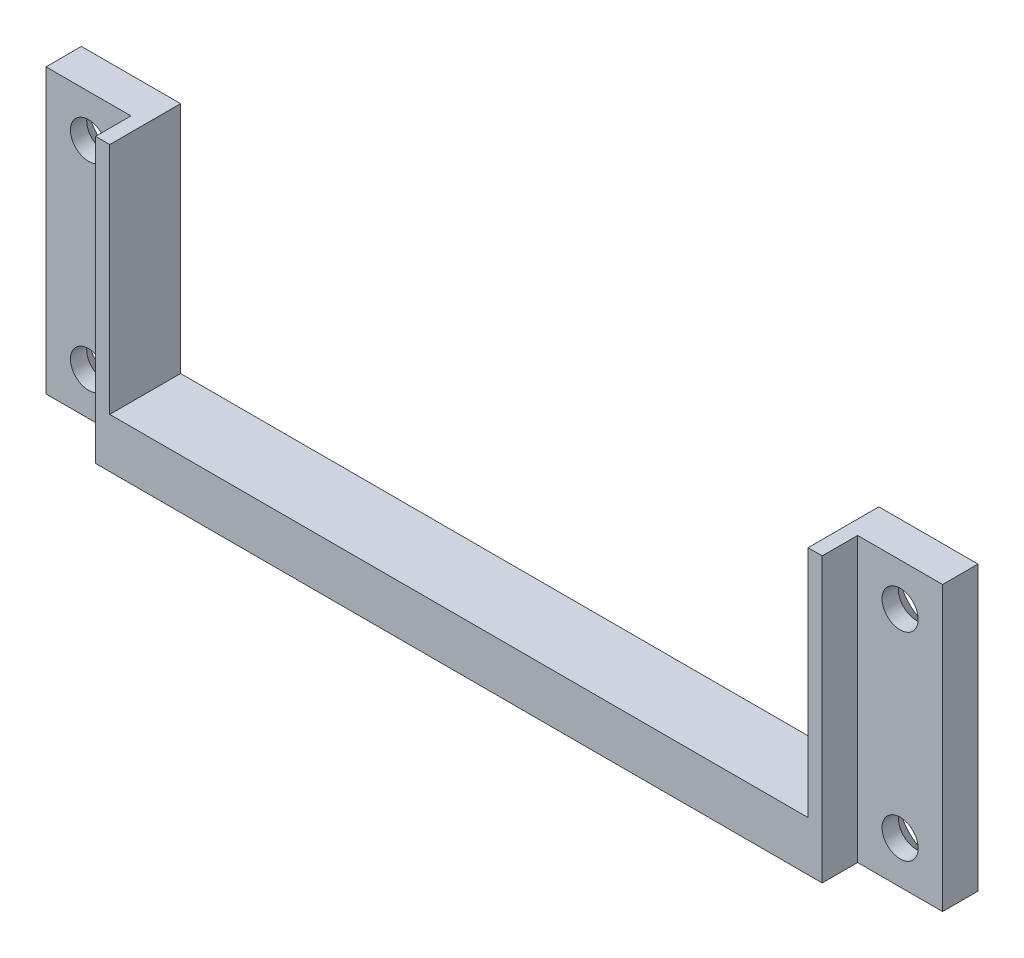
ISO-10303-21;
HEADER;
FILE_DESCRIPTION(('STEP AP214'),'2;1');
FILE_NAME('part.step','',(''),(''),'','','');
FILE_SCHEMA(('AUTOMOTIVE_DESIGN { 1 0 10303 214 1 1 1 1 }'));
ENDSEC;
DATA;
#1=APPLICATION_CONTEXT('core data for automotive mechanical design processes');
#2=APPLICATION_PROTOCOL_DEFINITION('international standard','automotive_design',2000,#1);
#3=PRODUCT_CONTEXT('',#1,'mechanical');
#4=PRODUCT('Part','Part','',(#3));
#5=PRODUCT_RELATED_PRODUCT_CATEGORY('part','',(#4));
#6=PRODUCT_DEFINITION_FORMATION('','',#4);
#7=PRODUCT_DEFINITION_CONTEXT('part definition',#1,'design');
#8=PRODUCT_DEFINITION('design','',#6,#7);
#9=PRODUCT_DEFINITION_SHAPE('','',#8);
#10=(LENGTH_UNIT() NAMED_UNIT(*) SI_UNIT(.MILLI.,.METRE.));
#11=(NAMED_UNIT(*) PLANE_ANGLE_UNIT() SI_UNIT($,.RADIAN.));
#12=(NAMED_UNIT(*) SI_UNIT($,.STERADIAN.) SOLID_ANGLE_UNIT());
#13=UNCERTAINTY_MEASURE_WITH_UNIT(LENGTH_MEASURE(1.E-05),#10,'distance_accuracy_value','');
#14=(GEOMETRIC_REPRESENTATION_CONTEXT(3) GLOBAL_UNCERTAINTY_ASSIGNED_CONTEXT((#13)) GLOBAL_UNIT_ASSIGNED_CONTEXT((#10,
#11,#12)) REPRESENTATION_CONTEXT('',''));
#15=CARTESIAN_POINT('',(0.,0.,0.));
#16=DIRECTION('',(0.,0.,1.));
#17=DIRECTION('',(1.,0.,0.));
#18=AXIS2_PLACEMENT_3D('',#15,#16,#17);
#19=CARTESIAN_POINT('',(-17.4678296060201,19.1867469879518,-0.0001));
#20=DIRECTION('',(0.,1.,0.));
#21=DIRECTION('',(0.,0.,1.));
#22=AXIS2_PLACEMENT_3D('',#19,#20,#21);
#23=PLANE('',#22);
#24=DIRECTION('',(0.,0.,1.));
#25=VECTOR('',#24,1.);
#26=CARTESIAN_POINT('',(-15.4678296060201,19.1867469879518,51.5999));
#27=LINE('',#26,#25);
#28=CARTESIAN_POINT('',(-15.4678296060201,19.1867469879518,-0.0001));
#29=VERTEX_POINT('',#28);
#30=CARTESIAN_POINT('',(-15.4678296060201,19.1867469879518,10.));
#31=VERTEX_POINT('',#30);
#32=EDGE_CURVE('E207',#29,#31,#27,.T.);
#33=ORIENTED_EDGE('',*,*,#32,.F.);
#34=DIRECTION('',(-1.,0.,0.));
#35=VECTOR('',#34,1.);
#36=CARTESIAN_POINT('',(-17.4678296060201,19.1867469879518,-0.0001));
#37=LINE('',#36,#35);
#38=CARTESIAN_POINT('',(-29.4678296060201,19.1867469879518,-0.0001));
#39=VERTEX_POINT('',#38);
#40=EDGE_CURVE('E153',#29,#39,#37,.T.);
#41=ORIENTED_EDGE('',*,*,#40,.T.);
#42=DIRECTION('',(0.,0.,-1.));
#43=VECTOR('',#42,1.);
#44=CARTESIAN_POINT('',(-29.4678296060201,19.1867469879518,-0.0001));
#45=LINE('',#44,#43);
#46=CARTESIAN_POINT('',(-29.4678296060201,19.1867469879518,4.9999));
#47=VERTEX_POINT('',#46);
#48=EDGE_CURVE('E188',#47,#39,#45,.T.);
#49=ORIENTED_EDGE('',*,*,#48,.F.);
#50=DIRECTION('',(1.,0.,0.));
#51=VECTOR('',#50,1.);
#52=CARTESIAN_POINT('',(-29.4678296060201,19.1867469879518,4.9999));
#53=LINE('',#52,#51);
#54=CARTESIAN_POINT('',(-17.4678296060201,19.1867469879518,4.9999));
#55=VERTEX_POINT('',#54);
#56=EDGE_CURVE('E191',#47,#55,#53,.T.);
#57=ORIENTED_EDGE('',*,*,#56,.T.);
#58=DIRECTION('',(0.,0.,1.));
#59=VECTOR('',#58,1.);
#60=CARTESIAN_POINT('',(-17.4678296060201,19.1867469879518,-0.0001));
#61=LINE('',#60,#59);
#62=CARTESIAN_POINT('',(-17.4678296060201,19.1867469879518,10.));
#63=VERTEX_POINT('',#62);
#64=EDGE_CURVE('E230',#55,#63,#61,.T.);
#65=ORIENTED_EDGE('',*,*,#64,.T.);
#66=DIRECTION('',(-1.,0.,0.));
#67=VECTOR('',#66,1.);
#68=CARTESIAN_POINT('',(-17.4678296060201,19.1867469879518,10.));
#69=LINE('',#68,#67);
#70=EDGE_CURVE('E226',#31,#63,#69,.T.);
#71=ORIENTED_EDGE('',*,*,#70,.F.);
#72=EDGE_LOOP('',(#33,#41,#49,#57,#65,#71));
#73=FACE_BOUND('',#72,.T.);
#74=ADVANCED_FACE('F48',(#73),#23,.T.);
#75=CARTESIAN_POINT('',(-17.4678296060201,19.1867469879518,-0.0001));
#76=DIRECTION('',(-1.,0.,0.));
#77=DIRECTION('',(0.,0.,1.));
#78=AXIS2_PLACEMENT_3D('',#75,#76,#77);
#79=PLANE('',#78);
#80=DIRECTION('',(0.,1.,0.));
#81=VECTOR('',#80,1.);
#82=CARTESIAN_POINT('',(-17.4678296060201,19.1867469879518,4.9999));
#83=LINE('',#82,#81);
#84=CARTESIAN_POINT('',(-17.4678296060201,-20.8132530120482,4.9999));
#85=VERTEX_POINT('',#84);
#86=EDGE_CURVE('E73',#85,#55,#83,.T.);
#87=ORIENTED_EDGE('',*,*,#86,.F.);
#88=DIRECTION('',(0.,0.,-1.));
#89=VECTOR('',#88,1.);
#90=CARTESIAN_POINT('',(-17.4678296060201,-20.8132530120482,-0.0001));
#91=LINE('',#90,#89);
#92=CARTESIAN_POINT('',(-17.4678296060201,-20.8132530120482,10.));
#93=VERTEX_POINT('',#92);
#94=EDGE_CURVE('E203',#93,#85,#91,.T.);
#95=ORIENTED_EDGE('',*,*,#94,.F.);
#96=DIRECTION('',(0.,-1.,0.));
#97=VECTOR('',#96,1.);
#98=CARTESIAN_POINT('',(-17.4678296060201,19.1867469879518,10.));
#99=LINE('',#98,#97);
#100=EDGE_CURVE('E220',#63,#93,#99,.T.);
#101=ORIENTED_EDGE('',*,*,#100,.F.);
#102=ORIENTED_EDGE('',*,*,#64,.F.);
#103=EDGE_LOOP('',(#87,#95,#101,#102));
#104=FACE_BOUND('',#103,.T.);
#105=ADVANCED_FACE('F50',(#104),#79,.T.);
#106=DIRECTION('',(0.,0.,-1.));
#107=VECTOR('',#106,1.);
#108=CARTESIAN_POINT('',(83.1321703939799,19.1867469879518,51.5999));
#109=LINE('',#108,#107);
#110=CARTESIAN_POINT('',(83.1321703939799,19.1867469879518,10.));
#111=VERTEX_POINT('',#110);
#112=CARTESIAN_POINT('',(83.1321703939799,19.1867469879518,-0.0001));
#113=VERTEX_POINT('',#112);
#114=EDGE_CURVE('E211',#111,#113,#109,.T.);
#115=ORIENTED_EDGE('',*,*,#114,.F.);
#116=CARTESIAN_POINT('',(85.1321703939799,19.1867469879518,10.));
#117=VERTEX_POINT('',#116);
#118=EDGE_CURVE('E227',#117,#111,#69,.T.);
#119=ORIENTED_EDGE('',*,*,#118,.F.);
#120=DIRECTION('',(0.,0.,1.));
#121=VECTOR('',#120,1.);
#122=CARTESIAN_POINT('',(85.1321703939799,19.1867469879518,-0.0001));
#123=LINE('',#122,#121);
#124=CARTESIAN_POINT('',(85.1321703939799,19.1867469879518,4.9999));
#125=VERTEX_POINT('',#124);
#126=EDGE_CURVE('E152',#125,#117,#123,.T.);
#127=ORIENTED_EDGE('',*,*,#126,.F.);
#128=DIRECTION('',(-1.,0.,0.));
#129=VECTOR('',#128,1.);
#130=CARTESIAN_POINT('',(97.1321703939799,19.1867469879518,4.9999));
#131=LINE('',#130,#129);
#132=CARTESIAN_POINT('',(97.1321703939799,19.1867469879518,4.9999));
#133=VERTEX_POINT('',#132);
#134=EDGE_CURVE('E159',#133,#125,#131,.T.);
#135=ORIENTED_EDGE('',*,*,#134,.F.);
#136=DIRECTION('',(0.,0.,1.));
#137=VECTOR('',#136,1.);
#138=CARTESIAN_POINT('',(97.1321703939799,19.1867469879518,-0.0001));
#139=LINE('',#138,#137);
#140=CARTESIAN_POINT('',(97.1321703939799,19.1867469879518,-0.0001));
#141=VERTEX_POINT('',#140);
#142=EDGE_CURVE('E156',#141,#133,#139,.T.);
#143=ORIENTED_EDGE('',*,*,#142,.F.);
#144=EDGE_CURVE('E141',#141,#113,#37,.T.);
#145=ORIENTED_EDGE('',*,*,#144,.T.);
#146=EDGE_LOOP('',(#115,#119,#127,#135,#143,#145));
#147=FACE_BOUND('',#146,.T.);
#148=ADVANCED_FACE('F157',(#147),#23,.T.);
#149=CARTESIAN_POINT('',(85.1321703939799,19.1867469879518,-0.0001));
#150=DIRECTION('',(1.,0.,0.));
#151=DIRECTION('',(0.,0.,-1.));
#152=AXIS2_PLACEMENT_3D('',#149,#150,#151);
#153=PLANE('',#152);
#154=DIRECTION('',(0.,-1.,0.));
#155=VECTOR('',#154,1.);
#156=CARTESIAN_POINT('',(85.1321703939799,19.1867469879518,4.9999));
#157=LINE('',#156,#155);
#158=CARTESIAN_POINT('',(85.1321703939799,-20.8132530120482,4.99989999999999));
#159=VERTEX_POINT('',#158);
#160=EDGE_CURVE('E65',#125,#159,#157,.T.);
#161=ORIENTED_EDGE('',*,*,#160,.F.);
#162=ORIENTED_EDGE('',*,*,#126,.T.);
#163=DIRECTION('',(0.,1.,0.));
#164=VECTOR('',#163,1.);
#165=CARTESIAN_POINT('',(85.1321703939799,19.1867469879518,10.));
#166=LINE('',#165,#164);
#167=CARTESIAN_POINT('',(85.1321703939799,-20.8132530120482,10.));
#168=VERTEX_POINT('',#167);
#169=EDGE_CURVE('E223',#168,#117,#166,.T.);
#170=ORIENTED_EDGE('',*,*,#169,.F.);
#171=DIRECTION('',(0.,0.,1.));
#172=VECTOR('',#171,1.);
#173=CARTESIAN_POINT('',(85.1321703939799,-20.8132530120482,-0.0001));
#174=LINE('',#173,#172);
#175=EDGE_CURVE('E198',#159,#168,#174,.T.);
#176=ORIENTED_EDGE('',*,*,#175,.F.);
#177=EDGE_LOOP('',(#161,#162,#170,#176));
#178=FACE_BOUND('',#177,.T.);
#179=ADVANCED_FACE('F290',(#178),#153,.T.);
#180=CARTESIAN_POINT('',(0.,0.,-0.0001));
#181=DIRECTION('',(0.,0.,1.));
#182=DIRECTION('',(1.,0.,0.));
#183=AXIS2_PLACEMENT_3D('',#180,#181,#182);
#184=PLANE('',#183);
#185=CARTESIAN_POINT('',(91.1321703939799,13.1867469879518,-0.000100000000001735));
#186=DIRECTION('',(0.,0.,-1.));
#187=DIRECTION('',(-1.,0.,0.));
#188=AXIS2_PLACEMENT_3D('',#185,#186,#187);
#189=CIRCLE('',#188,5.250000041);
#190=CARTESIAN_POINT('',(85.8821703529799,13.1867469879518,-0.000100000000001735));
#191=VERTEX_POINT('',#190);
#192=EDGE_CURVE('E415',#191,#191,#189,.T.);
#193=ORIENTED_EDGE('',*,*,#192,.F.);
#194=EDGE_LOOP('',(#193));
#195=FACE_BOUND('',#194,.T.);
#196=CARTESIAN_POINT('',(91.1321703939799,-14.8132530120482,-0.000100000000001735));
#197=DIRECTION('',(0.,0.,-1.));
#198=DIRECTION('',(-1.,0.,0.));
#199=AXIS2_PLACEMENT_3D('',#196,#197,#198);
#200=CIRCLE('',#199,5.250000041);
#201=CARTESIAN_POINT('',(85.8821703529799,-14.8132530120482,-0.000100000000001735));
#202=VERTEX_POINT('',#201);
#203=EDGE_CURVE('E251',#202,#202,#200,.T.);
#204=ORIENTED_EDGE('',*,*,#203,.F.);
#205=EDGE_LOOP('',(#204));
#206=FACE_BOUND('',#205,.T.);
#207=CARTESIAN_POINT('',(-23.4678296060201,13.1867469879518,-0.000100000000001735));
#208=DIRECTION('',(0.,0.,-1.));
#209=DIRECTION('',(-1.,0.,0.));
#210=AXIS2_PLACEMENT_3D('',#207,#208,#209);
#211=CIRCLE('',#210,5.250000041);
#212=CARTESIAN_POINT('',(-28.7178296470201,13.1867469879518,-0.000100000000001735));
#213=VERTEX_POINT('',#212);
#214=EDGE_CURVE('E244',#213,#213,#211,.T.);
#215=ORIENTED_EDGE('',*,*,#214,.F.);
#216=EDGE_LOOP('',(#215));
#217=FACE_BOUND('',#216,.T.);
#218=CARTESIAN_POINT('',(-23.4678296060201,-14.8132530120482,-0.000100000000001735));
#219=DIRECTION('',(0.,0.,-1.));
#220=DIRECTION('',(-1.,0.,0.));
#221=AXIS2_PLACEMENT_3D('',#218,#219,#220);
#222=CIRCLE('',#221,5.250000041);
#223=CARTESIAN_POINT('',(-28.7178296470201,-14.8132530120482,-0.000100000000001735));
#224=VERTEX_POINT('',#223);
#225=EDGE_CURVE('E240',#224,#224,#222,.T.);
#226=ORIENTED_EDGE('',*,*,#225,.F.);
#227=EDGE_LOOP('',(#226));
#228=FACE_BOUND('',#227,.T.);
#229=ORIENTED_EDGE('',*,*,#40,.F.);
#230=DIRECTION('',(0.,1.,0.));
#231=VECTOR('',#230,1.);
#232=CARTESIAN_POINT('',(-15.4678296060201,-13.8132530120482,-0.0001));
#233=LINE('',#232,#231);
#234=CARTESIAN_POINT('',(-15.4678296060201,-13.8132530120482,-0.0001));
#235=VERTEX_POINT('',#234);
#236=EDGE_CURVE('E218',#235,#29,#233,.T.);
#237=ORIENTED_EDGE('',*,*,#236,.F.);
#238=DIRECTION('',(-1.,0.,0.));
#239=VECTOR('',#238,1.);
#240=CARTESIAN_POINT('',(-15.4678296060201,-13.8132530120482,-0.0001));
#241=LINE('',#240,#239);
#242=CARTESIAN_POINT('',(83.1321703939799,-13.8132530120482,-0.0001));
#243=VERTEX_POINT('',#242);
#244=EDGE_CURVE('E213',#243,#235,#241,.T.);
#245=ORIENTED_EDGE('',*,*,#244,.F.);
#246=DIRECTION('',(0.,1.,0.));
#247=VECTOR('',#246,1.);
#248=CARTESIAN_POINT('',(83.1321703939799,-13.8132530120482,-0.0001));
#249=LINE('',#248,#247);
#250=EDGE_CURVE('E149',#243,#113,#249,.T.);
#251=ORIENTED_EDGE('',*,*,#250,.T.);
#252=ORIENTED_EDGE('',*,*,#144,.F.);
#253=DIRECTION('',(0.,1.,0.));
#254=VECTOR('',#253,1.);
#255=CARTESIAN_POINT('',(97.1321703939799,19.1867469879518,-0.0001));
#256=LINE('',#255,#254);
#257=CARTESIAN_POINT('',(97.1321703939799,-20.8132530120482,-0.0001));
#258=VERTEX_POINT('',#257);
#259=EDGE_CURVE('E146',#258,#141,#256,.T.);
#260=ORIENTED_EDGE('',*,*,#259,.F.);
#261=DIRECTION('',(1.,0.,0.));
#262=VECTOR('',#261,1.);
#263=CARTESIAN_POINT('',(85.1321703939799,-20.8132530120482,-0.0001));
#264=LINE('',#263,#262);
#265=CARTESIAN_POINT('',(-29.4678296060201,-20.8132530120482,-0.0001));
#266=VERTEX_POINT('',#265);
#267=EDGE_CURVE('E205',#266,#258,#264,.T.);
#268=ORIENTED_EDGE('',*,*,#267,.F.);
#269=DIRECTION('',(0.,-1.,0.));
#270=VECTOR('',#269,1.);
#271=CARTESIAN_POINT('',(-29.4678296060201,19.1867469879518,-0.0001));
#272=LINE('',#271,#270);
#273=EDGE_CURVE('E181',#39,#266,#272,.T.);
#274=ORIENTED_EDGE('',*,*,#273,.F.);
#275=EDGE_LOOP('',(#229,#237,#245,#251,#252,#260,#268,#274));
#276=FACE_BOUND('',#275,.T.);
#277=ADVANCED_FACE('F144',(#195,#206,#217,#228,#276),#184,.F.);
#278=CARTESIAN_POINT('',(0.,0.,10.));
#279=DIRECTION('',(0.,0.,1.));
#280=DIRECTION('',(1.,0.,0.));
#281=AXIS2_PLACEMENT_3D('',#278,#279,#280);
#282=PLANE('',#281);
#283=DIRECTION('',(0.,-1.,0.));
#284=VECTOR('',#283,1.);
#285=CARTESIAN_POINT('',(-15.4678296060201,0.,10.));
#286=LINE('',#285,#284);
#287=CARTESIAN_POINT('',(-15.4678296060201,-13.8132530120482,10.));
#288=VERTEX_POINT('',#287);
#289=EDGE_CURVE('E13',#31,#288,#286,.T.);
#290=ORIENTED_EDGE('',*,*,#289,.F.);
#291=ORIENTED_EDGE('',*,*,#70,.T.);
#292=ORIENTED_EDGE('',*,*,#100,.T.);
#293=DIRECTION('',(-1.,0.,0.));
#294=VECTOR('',#293,1.);
#295=CARTESIAN_POINT('',(85.1321703939799,-20.8132530120482,10.));
#296=LINE('',#295,#294);
#297=EDGE_CURVE('E200',#168,#93,#296,.T.);
#298=ORIENTED_EDGE('',*,*,#297,.F.);
#299=ORIENTED_EDGE('',*,*,#169,.T.);
#300=ORIENTED_EDGE('',*,*,#118,.T.);
#301=DIRECTION('',(0.,1.,0.));
#302=VECTOR('',#301,1.);
#303=CARTESIAN_POINT('',(83.1321703939799,0.,10.));
#304=LINE('',#303,#302);
#305=CARTESIAN_POINT('',(83.1321703939799,-13.8132530120482,10.));
#306=VERTEX_POINT('',#305);
#307=EDGE_CURVE('E57',#306,#111,#304,.T.);
#308=ORIENTED_EDGE('',*,*,#307,.F.);
#309=DIRECTION('',(1.,0.,0.));
#310=VECTOR('',#309,1.);
#311=CARTESIAN_POINT('',(0.,-13.8132530120482,10.));
#312=LINE('',#311,#310);
#313=EDGE_CURVE('E232',#288,#306,#312,.T.);
#314=ORIENTED_EDGE('',*,*,#313,.F.);
#315=EDGE_LOOP('',(#290,#291,#292,#298,#299,#300,#308,#314));
#316=FACE_BOUND('',#315,.T.);
#317=ADVANCED_FACE('F297',(#316),#282,.T.);
#318=CARTESIAN_POINT('',(-15.4678296060201,-13.8132530120482,51.5999));
#319=DIRECTION('',(-1.,0.,0.));
#320=DIRECTION('',(0.,0.,1.));
#321=AXIS2_PLACEMENT_3D('',#318,#319,#320);
#322=PLANE('',#321);
#323=ORIENTED_EDGE('',*,*,#289,.T.);
#324=DIRECTION('',(0.,0.,1.));
#325=VECTOR('',#324,1.);
#326=CARTESIAN_POINT('',(-15.4678296060201,-13.8132530120482,51.5999));
#327=LINE('',#326,#325);
#328=EDGE_CURVE('E208',#235,#288,#327,.T.);
#329=ORIENTED_EDGE('',*,*,#328,.F.);
#330=ORIENTED_EDGE('',*,*,#236,.T.);
#331=ORIENTED_EDGE('',*,*,#32,.T.);
#332=EDGE_LOOP('',(#323,#329,#330,#331));
#333=FACE_BOUND('',#332,.T.);
#334=ADVANCED_FACE('F302',(#333),#322,.F.);
#335=CARTESIAN_POINT('',(83.1321703939799,-13.8132530120482,51.5999));
#336=DIRECTION('',(1.,0.,0.));
#337=DIRECTION('',(0.,0.,-1.));
#338=AXIS2_PLACEMENT_3D('',#335,#336,#337);
#339=PLANE('',#338);
#340=ORIENTED_EDGE('',*,*,#307,.T.);
#341=ORIENTED_EDGE('',*,*,#114,.T.);
#342=ORIENTED_EDGE('',*,*,#250,.F.);
#343=DIRECTION('',(0.,0.,-1.));
#344=VECTOR('',#343,1.);
#345=CARTESIAN_POINT('',(83.1321703939799,-13.8132530120482,51.5999));
#346=LINE('',#345,#344);
#347=EDGE_CURVE('E210',#306,#243,#346,.T.);
#348=ORIENTED_EDGE('',*,*,#347,.F.);
#349=EDGE_LOOP('',(#340,#341,#342,#348));
#350=FACE_BOUND('',#349,.T.);
#351=ADVANCED_FACE('F310',(#350),#339,.F.);
#352=CARTESIAN_POINT('',(0.,-13.8132530120482,0.));
#353=DIRECTION('',(0.,-1.,0.));
#354=DIRECTION('',(0.,0.,-1.));
#355=AXIS2_PLACEMENT_3D('',#352,#353,#354);
#356=PLANE('',#355);
#357=ORIENTED_EDGE('',*,*,#313,.T.);
#358=ORIENTED_EDGE('',*,*,#347,.T.);
#359=ORIENTED_EDGE('',*,*,#244,.T.);
#360=ORIENTED_EDGE('',*,*,#328,.T.);
#361=EDGE_LOOP('',(#357,#358,#359,#360));
#362=FACE_BOUND('',#361,.T.);
#363=ADVANCED_FACE('F314',(#362),#356,.F.);
#364=CARTESIAN_POINT('',(0.,-20.8132530120482,0.));
#365=DIRECTION('',(0.,-1.,0.));
#366=DIRECTION('',(0.,0.,-1.));
#367=AXIS2_PLACEMENT_3D('',#364,#365,#366);
#368=PLANE('',#367);
#369=ORIENTED_EDGE('',*,*,#267,.T.);
#370=DIRECTION('',(0.,0.,-1.));
#371=VECTOR('',#370,1.);
#372=CARTESIAN_POINT('',(97.1321703939799,-20.8132530120482,-0.0001));
#373=LINE('',#372,#371);
#374=CARTESIAN_POINT('',(97.1321703939799,-20.8132530120482,4.99989999999999));
#375=VERTEX_POINT('',#374);
#376=EDGE_CURVE('E167',#375,#258,#373,.T.);
#377=ORIENTED_EDGE('',*,*,#376,.F.);
#378=DIRECTION('',(-1.,0.,0.));
#379=VECTOR('',#378,1.);
#380=CARTESIAN_POINT('',(97.1321703939799,-20.8132530120482,4.99989999999999));
#381=LINE('',#380,#379);
#382=EDGE_CURVE('E176',#375,#159,#381,.T.);
#383=ORIENTED_EDGE('',*,*,#382,.T.);
#384=ORIENTED_EDGE('',*,*,#175,.T.);
#385=ORIENTED_EDGE('',*,*,#297,.T.);
#386=ORIENTED_EDGE('',*,*,#94,.T.);
#387=DIRECTION('',(1.,0.,0.));
#388=VECTOR('',#387,1.);
#389=CARTESIAN_POINT('',(-29.4678296060201,-20.8132530120482,4.99990000000001));
#390=LINE('',#389,#388);
#391=CARTESIAN_POINT('',(-29.4678296060201,-20.8132530120482,4.99990000000001));
#392=VERTEX_POINT('',#391);
#393=EDGE_CURVE('E195',#392,#85,#390,.T.);
#394=ORIENTED_EDGE('',*,*,#393,.F.);
#395=DIRECTION('',(0.,0.,1.));
#396=VECTOR('',#395,1.);
#397=CARTESIAN_POINT('',(-29.4678296060201,-20.8132530120482,-0.0001));
#398=LINE('',#397,#396);
#399=EDGE_CURVE('E184',#266,#392,#398,.T.);
#400=ORIENTED_EDGE('',*,*,#399,.F.);
#401=EDGE_LOOP('',(#369,#377,#383,#384,#385,#386,#394,#400));
#402=FACE_BOUND('',#401,.T.);
#403=ADVANCED_FACE('F318',(#402),#368,.T.);
#404=CARTESIAN_POINT('',(-29.4678296060201,19.1867469879518,4.9999));
#405=DIRECTION('',(0.,0.,-1.));
#406=DIRECTION('',(0.,1.,0.));
#407=AXIS2_PLACEMENT_3D('',#404,#405,#406);
#408=PLANE('',#407);
#409=CARTESIAN_POINT('',(-23.4678296060201,13.1867469879518,4.9999));
#410=DIRECTION('',(0.,0.,-1.));
#411=DIRECTION('',(0.,1.,0.));
#412=AXIS2_PLACEMENT_3D('',#409,#410,#411);
#413=CIRCLE('',#412,2.54999998);
#414=CARTESIAN_POINT('',(-23.4678296060201,15.7367469679518,4.9999));
#415=VERTEX_POINT('',#414);
#416=EDGE_CURVE('E238',#415,#415,#413,.T.);
#417=ORIENTED_EDGE('',*,*,#416,.T.);
#418=EDGE_LOOP('',(#417));
#419=FACE_BOUND('',#418,.T.);
#420=CARTESIAN_POINT('',(-23.4678296060201,-14.8132530120482,4.99990000000001));
#421=DIRECTION('',(0.,0.,-1.));
#422=DIRECTION('',(0.,1.,0.));
#423=AXIS2_PLACEMENT_3D('',#420,#421,#422);
#424=CIRCLE('',#423,2.54999998);
#425=CARTESIAN_POINT('',(-23.4678296060201,-12.2632530320482,4.99990000000001));
#426=VERTEX_POINT('',#425);
#427=EDGE_CURVE('E169',#426,#426,#424,.T.);
#428=ORIENTED_EDGE('',*,*,#427,.T.);
#429=EDGE_LOOP('',(#428));
#430=FACE_BOUND('',#429,.T.);
#431=ORIENTED_EDGE('',*,*,#86,.T.);
#432=ORIENTED_EDGE('',*,*,#56,.F.);
#433=DIRECTION('',(0.,1.,0.));
#434=VECTOR('',#433,1.);
#435=CARTESIAN_POINT('',(-29.4678296060201,19.1867469879518,4.9999));
#436=LINE('',#435,#434);
#437=EDGE_CURVE('E186',#392,#47,#436,.T.);
#438=ORIENTED_EDGE('',*,*,#437,.F.);
#439=ORIENTED_EDGE('',*,*,#393,.T.);
#440=EDGE_LOOP('',(#431,#432,#438,#439));
#441=FACE_BOUND('',#440,.T.);
#442=ADVANCED_FACE('F322',(#419,#430,#441),#408,.F.);
#443=CARTESIAN_POINT('',(-29.4678296060201,0.,0.));
#444=DIRECTION('',(-1.,0.,0.));
#445=DIRECTION('',(0.,0.,1.));
#446=AXIS2_PLACEMENT_3D('',#443,#444,#445);
#447=PLANE('',#446);
#448=ORIENTED_EDGE('',*,*,#273,.T.);
#449=ORIENTED_EDGE('',*,*,#399,.T.);
#450=ORIENTED_EDGE('',*,*,#437,.T.);
#451=ORIENTED_EDGE('',*,*,#48,.T.);
#452=EDGE_LOOP('',(#448,#449,#450,#451));
#453=FACE_BOUND('',#452,.T.);
#454=ADVANCED_FACE('F326',(#453),#447,.T.);
#455=CARTESIAN_POINT('',(97.1321703939799,19.1867469879518,4.9999));
#456=DIRECTION('',(0.,0.,-1.));
#457=DIRECTION('',(0.,1.,0.));
#458=AXIS2_PLACEMENT_3D('',#455,#456,#457);
#459=PLANE('',#458);
#460=CARTESIAN_POINT('',(91.1321703939799,13.1867469879518,4.9999));
#461=DIRECTION('',(0.,0.,-1.));
#462=DIRECTION('',(0.,1.,0.));
#463=AXIS2_PLACEMENT_3D('',#460,#461,#462);
#464=CIRCLE('',#463,2.54999998);
#465=CARTESIAN_POINT('',(91.1321703939799,15.7367469679518,4.9999));
#466=VERTEX_POINT('',#465);
#467=EDGE_CURVE('E52',#466,#466,#464,.T.);
#468=ORIENTED_EDGE('',*,*,#467,.T.);
#469=EDGE_LOOP('',(#468));
#470=FACE_BOUND('',#469,.T.);
#471=CARTESIAN_POINT('',(91.1321703939799,-14.8132530120482,4.9999));
#472=DIRECTION('',(0.,0.,-1.));
#473=DIRECTION('',(0.,1.,0.));
#474=AXIS2_PLACEMENT_3D('',#471,#472,#473);
#475=CIRCLE('',#474,2.54999998);
#476=CARTESIAN_POINT('',(91.1321703939799,-12.2632530320482,4.9999));
#477=VERTEX_POINT('',#476);
#478=EDGE_CURVE('E242',#477,#477,#475,.T.);
#479=ORIENTED_EDGE('',*,*,#478,.T.);
#480=EDGE_LOOP('',(#479));
#481=FACE_BOUND('',#480,.T.);
#482=ORIENTED_EDGE('',*,*,#160,.T.);
#483=ORIENTED_EDGE('',*,*,#382,.F.);
#484=DIRECTION('',(0.,-1.,0.));
#485=VECTOR('',#484,1.);
#486=CARTESIAN_POINT('',(97.1321703939799,19.1867469879518,4.9999));
#487=LINE('',#486,#485);
#488=EDGE_CURVE('E162',#133,#375,#487,.T.);
#489=ORIENTED_EDGE('',*,*,#488,.F.);
#490=ORIENTED_EDGE('',*,*,#134,.T.);
#491=EDGE_LOOP('',(#482,#483,#489,#490));
#492=FACE_BOUND('',#491,.T.);
#493=ADVANCED_FACE('F330',(#470,#481,#492),#459,.F.);
#494=CARTESIAN_POINT('',(97.1321703939799,0.,0.));
#495=DIRECTION('',(-1.,0.,0.));
#496=DIRECTION('',(0.,0.,1.));
#497=AXIS2_PLACEMENT_3D('',#494,#495,#496);
#498=PLANE('',#497);
#499=ORIENTED_EDGE('',*,*,#259,.T.);
#500=ORIENTED_EDGE('',*,*,#142,.T.);
#501=ORIENTED_EDGE('',*,*,#488,.T.);
#502=ORIENTED_EDGE('',*,*,#376,.T.);
#503=EDGE_LOOP('',(#499,#500,#501,#502));
#504=FACE_BOUND('',#503,.T.);
#505=ADVANCED_FACE('F165',(#504),#498,.F.);
#506=CARTESIAN_POINT('',(-23.4678296060201,-14.8132530120482,-0.0001));
#507=DIRECTION('',(0.,0.,-1.));
#508=DIRECTION('',(-1.,0.,0.));
#509=AXIS2_PLACEMENT_3D('',#506,#507,#508);
#510=CYLINDRICAL_SURFACE('',#509,2.54999998);
#511=CARTESIAN_POINT('',(-23.4678296060201,-14.8132530120482,2.699900061));
#512=DIRECTION('',(0.,0.,-1.));
#513=DIRECTION('',(-1.,0.,0.));
#514=AXIS2_PLACEMENT_3D('',#511,#512,#513);
#515=CIRCLE('',#514,2.54999998);
#516=CARTESIAN_POINT('',(-26.0178295860201,-14.8132530120482,2.699900061));
#517=VERTEX_POINT('',#516);
#518=EDGE_CURVE('E172',#517,#517,#515,.T.);
#519=ORIENTED_EDGE('',*,*,#518,.T.);
#520=EDGE_LOOP('',(#519));
#521=FACE_BOUND('',#520,.T.);
#522=ORIENTED_EDGE('',*,*,#427,.F.);
#523=EDGE_LOOP('',(#522));
#524=FACE_BOUND('',#523,.T.);
#525=ADVANCED_FACE('F266',(#521,#524),#510,.F.);
#526=CARTESIAN_POINT('',(-23.4678296060201,-14.8132530120482,-0.000100000000001735));
#527=DIRECTION('',(0.,0.,-1.));
#528=DIRECTION('',(-1.,0.,0.));
#529=AXIS2_PLACEMENT_3D('',#526,#527,#528);
#530=CONICAL_SURFACE('',#529,5.250000041,0.785398163397448);
#531=ORIENTED_EDGE('',*,*,#518,.F.);
#532=EDGE_LOOP('',(#531));
#533=FACE_BOUND('',#532,.T.);
#534=ORIENTED_EDGE('',*,*,#225,.T.);
#535=EDGE_LOOP('',(#534));
#536=FACE_BOUND('',#535,.T.);
#537=ADVANCED_FACE('F269',(#533,#536),#530,.F.);
#538=CARTESIAN_POINT('',(-23.4678296060201,13.1867469879518,-0.0001));
#539=DIRECTION('',(0.,0.,-1.));
#540=DIRECTION('',(-1.,0.,0.));
#541=AXIS2_PLACEMENT_3D('',#538,#539,#540);
#542=CYLINDRICAL_SURFACE('',#541,2.54999998);
#543=CARTESIAN_POINT('',(-23.4678296060201,13.1867469879518,2.699900061));
#544=DIRECTION('',(0.,0.,-1.));
#545=DIRECTION('',(-1.,0.,0.));
#546=AXIS2_PLACEMENT_3D('',#543,#544,#545);
#547=CIRCLE('',#546,2.54999998);
#548=CARTESIAN_POINT('',(-26.0178295860201,13.1867469879518,2.699900061));
#549=VERTEX_POINT('',#548);
#550=EDGE_CURVE('E241',#549,#549,#547,.T.);
#551=ORIENTED_EDGE('',*,*,#550,.T.);
#552=EDGE_LOOP('',(#551));
#553=FACE_BOUND('',#552,.T.);
#554=ORIENTED_EDGE('',*,*,#416,.F.);
#555=EDGE_LOOP('',(#554));
#556=FACE_BOUND('',#555,.T.);
#557=ADVANCED_FACE('F271',(#553,#556),#542,.F.);
#558=CARTESIAN_POINT('',(-23.4678296060201,13.1867469879518,-0.000100000000001735));
#559=DIRECTION('',(0.,0.,-1.));
#560=DIRECTION('',(-1.,0.,0.));
#561=AXIS2_PLACEMENT_3D('',#558,#559,#560);
#562=CONICAL_SURFACE('',#561,5.250000041,0.785398163397448);
#563=ORIENTED_EDGE('',*,*,#550,.F.);
#564=EDGE_LOOP('',(#563));
#565=FACE_BOUND('',#564,.T.);
#566=ORIENTED_EDGE('',*,*,#214,.T.);
#567=EDGE_LOOP('',(#566));
#568=FACE_BOUND('',#567,.T.);
#569=ADVANCED_FACE('F277',(#565,#568),#562,.F.);
#570=CARTESIAN_POINT('',(91.1321703939799,-14.8132530120482,-0.0001));
#571=DIRECTION('',(0.,0.,-1.));
#572=DIRECTION('',(-1.,0.,0.));
#573=AXIS2_PLACEMENT_3D('',#570,#571,#572);
#574=CYLINDRICAL_SURFACE('',#573,2.54999998);
#575=CARTESIAN_POINT('',(91.1321703939799,-14.8132530120482,2.699900061));
#576=DIRECTION('',(0.,0.,-1.));
#577=DIRECTION('',(-1.,0.,0.));
#578=AXIS2_PLACEMENT_3D('',#575,#576,#577);
#579=CIRCLE('',#578,2.54999998);
#580=CARTESIAN_POINT('',(88.5821704139799,-14.8132530120482,2.699900061));
#581=VERTEX_POINT('',#580);
#582=EDGE_CURVE('E245',#581,#581,#579,.T.);
#583=ORIENTED_EDGE('',*,*,#582,.T.);
#584=EDGE_LOOP('',(#583));
#585=FACE_BOUND('',#584,.T.);
#586=ORIENTED_EDGE('',*,*,#478,.F.);
#587=EDGE_LOOP('',(#586));
#588=FACE_BOUND('',#587,.T.);
#589=ADVANCED_FACE('F367',(#585,#588),#574,.F.);
#590=CARTESIAN_POINT('',(91.1321703939799,-14.8132530120482,-0.000100000000001735));
#591=DIRECTION('',(0.,0.,-1.));
#592=DIRECTION('',(-1.,0.,0.));
#593=AXIS2_PLACEMENT_3D('',#590,#591,#592);
#594=CONICAL_SURFACE('',#593,5.250000041,0.785398163397449);
#595=ORIENTED_EDGE('',*,*,#582,.F.);
#596=EDGE_LOOP('',(#595));
#597=FACE_BOUND('',#596,.T.);
#598=ORIENTED_EDGE('',*,*,#203,.T.);
#599=EDGE_LOOP('',(#598));
#600=FACE_BOUND('',#599,.T.);
#601=ADVANCED_FACE('F377',(#597,#600),#594,.F.);
#602=CARTESIAN_POINT('',(91.1321703939799,13.1867469879518,-0.0001));
#603=DIRECTION('',(0.,0.,-1.));
#604=DIRECTION('',(-1.,0.,0.));
#605=AXIS2_PLACEMENT_3D('',#602,#603,#604);
#606=CYLINDRICAL_SURFACE('',#605,2.54999998);
#607=CARTESIAN_POINT('',(91.1321703939799,13.1867469879518,2.699900061));
#608=DIRECTION('',(0.,0.,-1.));
#609=DIRECTION('',(-1.,0.,0.));
#610=AXIS2_PLACEMENT_3D('',#607,#608,#609);
#611=CIRCLE('',#610,2.54999998);
#612=CARTESIAN_POINT('',(88.5821704139799,13.1867469879518,2.699900061));
#613=VERTEX_POINT('',#612);
#614=EDGE_CURVE('E413',#613,#613,#611,.T.);
#615=ORIENTED_EDGE('',*,*,#614,.T.);
#616=EDGE_LOOP('',(#615));
#617=FACE_BOUND('',#616,.T.);
#618=ORIENTED_EDGE('',*,*,#467,.F.);
#619=EDGE_LOOP('',(#618));
#620=FACE_BOUND('',#619,.T.);
#621=ADVANCED_FACE('F386',(#617,#620),#606,.F.);
#622=CARTESIAN_POINT('',(91.1321703939799,13.1867469879518,-0.000100000000001735));
#623=DIRECTION('',(0.,0.,-1.));
#624=DIRECTION('',(-1.,0.,0.));
#625=AXIS2_PLACEMENT_3D('',#622,#623,#624);
#626=CONICAL_SURFACE('',#625,5.250000041,0.785398163397449);
#627=ORIENTED_EDGE('',*,*,#614,.F.);
#628=EDGE_LOOP('',(#627));
#629=FACE_BOUND('',#628,.T.);
#630=ORIENTED_EDGE('',*,*,#192,.T.);
#631=EDGE_LOOP('',(#630));
#632=FACE_BOUND('',#631,.T.);
#633=ADVANCED_FACE('F396',(#629,#632),#626,.F.);
#634=CLOSED_SHELL('',(#74,#105,#148,#179,#277,#317,#334,#351,#363,#403,#442,#454,#493,#505,#525,
#537,#557,#569,#589,#601,#621,#633));
#635=MANIFOLD_SOLID_BREP('B2',#634);
#636=ADVANCED_BREP_SHAPE_REPRESENTATION('',(#18,#635),#14);
#637=SHAPE_DEFINITION_REPRESENTATION(#9,#636);
ENDSEC;
END-ISO-10303-21;
